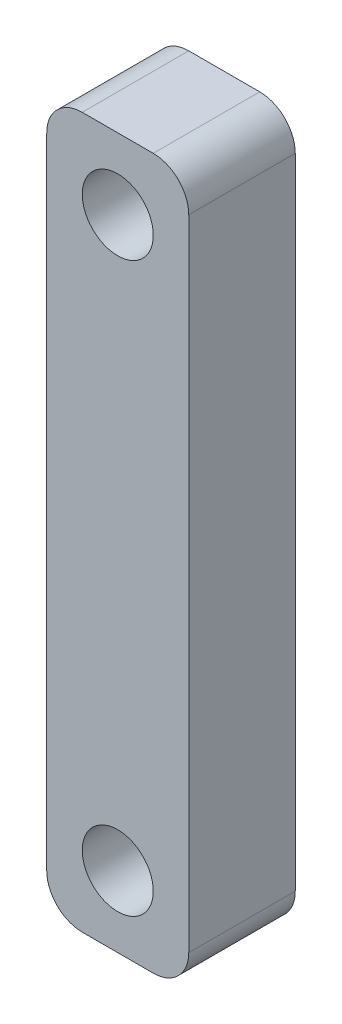
ISO-10303-21;
HEADER;
FILE_DESCRIPTION(('STEP AP214'),'2;1');
FILE_NAME('part.step','',(''),(''),'','','');
FILE_SCHEMA(('AUTOMOTIVE_DESIGN { 1 0 10303 214 1 1 1 1 }'));
ENDSEC;
DATA;
#1=APPLICATION_CONTEXT('core data for automotive mechanical design processes');
#2=APPLICATION_PROTOCOL_DEFINITION('international standard','automotive_design',2000,#1);
#3=PRODUCT_CONTEXT('',#1,'mechanical');
#4=PRODUCT('Part','Part','',(#3));
#5=PRODUCT_RELATED_PRODUCT_CATEGORY('part','',(#4));
#6=PRODUCT_DEFINITION_FORMATION('','',#4);
#7=PRODUCT_DEFINITION_CONTEXT('part definition',#1,'design');
#8=PRODUCT_DEFINITION('design','',#6,#7);
#9=PRODUCT_DEFINITION_SHAPE('','',#8);
#10=(LENGTH_UNIT() NAMED_UNIT(*) SI_UNIT(.MILLI.,.METRE.));
#11=(NAMED_UNIT(*) PLANE_ANGLE_UNIT() SI_UNIT($,.RADIAN.));
#12=(NAMED_UNIT(*) SI_UNIT($,.STERADIAN.) SOLID_ANGLE_UNIT());
#13=UNCERTAINTY_MEASURE_WITH_UNIT(LENGTH_MEASURE(1.E-05),#10,'distance_accuracy_value','');
#14=(GEOMETRIC_REPRESENTATION_CONTEXT(3) GLOBAL_UNCERTAINTY_ASSIGNED_CONTEXT((#13)) GLOBAL_UNIT_ASSIGNED_CONTEXT((#10,
#11,#12)) REPRESENTATION_CONTEXT('',''));
#15=CARTESIAN_POINT('',(0.,0.,0.));
#16=DIRECTION('',(0.,0.,1.));
#17=DIRECTION('',(1.,0.,0.));
#18=AXIS2_PLACEMENT_3D('',#15,#16,#17);
#19=CARTESIAN_POINT('',(0.,0.,3.));
#20=DIRECTION('',(1.,0.,0.));
#21=DIRECTION('',(0.,0.,-1.));
#22=AXIS2_PLACEMENT_3D('',#19,#20,#21);
#23=PLANE('',#22);
#24=DIRECTION('',(0.,-1.,0.));
#25=VECTOR('',#24,1.);
#26=CARTESIAN_POINT('',(0.,0.,3.));
#27=LINE('',#26,#25);
#28=CARTESIAN_POINT('',(0.,19.,3.));
#29=VERTEX_POINT('',#28);
#30=CARTESIAN_POINT('',(0.,1.,3.));
#31=VERTEX_POINT('',#30);
#32=EDGE_CURVE('E117',#29,#31,#27,.T.);
#33=ORIENTED_EDGE('',*,*,#32,.F.);
#34=DIRECTION('',(0.,0.,-1.));
#35=VECTOR('',#34,1.);
#36=CARTESIAN_POINT('',(0.,19.,3.));
#37=LINE('',#36,#35);
#38=CARTESIAN_POINT('',(0.,19.,0.));
#39=VERTEX_POINT('',#38);
#40=EDGE_CURVE('E145',#29,#39,#37,.T.);
#41=ORIENTED_EDGE('',*,*,#40,.T.);
#42=DIRECTION('',(0.,-1.,0.));
#43=VECTOR('',#42,1.);
#44=CARTESIAN_POINT('',(0.,0.,0.));
#45=LINE('',#44,#43);
#46=CARTESIAN_POINT('',(0.,1.,0.));
#47=VERTEX_POINT('',#46);
#48=EDGE_CURVE('E119',#39,#47,#45,.T.);
#49=ORIENTED_EDGE('',*,*,#48,.T.);
#50=DIRECTION('',(0.,0.,-1.));
#51=VECTOR('',#50,1.);
#52=CARTESIAN_POINT('',(0.,1.,3.));
#53=LINE('',#52,#51);
#54=EDGE_CURVE('E140',#47,#31,#53,.F.);
#55=ORIENTED_EDGE('',*,*,#54,.T.);
#56=EDGE_LOOP('',(#33,#41,#49,#55));
#57=FACE_BOUND('',#56,.T.);
#58=ADVANCED_FACE('F33',(#57),#23,.F.);
#59=CARTESIAN_POINT('',(0.,0.,3.));
#60=DIRECTION('',(0.,1.,0.));
#61=DIRECTION('',(0.,0.,1.));
#62=AXIS2_PLACEMENT_3D('',#59,#60,#61);
#63=PLANE('',#62);
#64=DIRECTION('',(1.,0.,0.));
#65=VECTOR('',#64,1.);
#66=CARTESIAN_POINT('',(0.,0.,3.));
#67=LINE('',#66,#65);
#68=CARTESIAN_POINT('',(1.,0.,3.));
#69=VERTEX_POINT('',#68);
#70=CARTESIAN_POINT('',(3.,0.,3.));
#71=VERTEX_POINT('',#70);
#72=EDGE_CURVE('E177',#69,#71,#67,.T.);
#73=ORIENTED_EDGE('',*,*,#72,.F.);
#74=DIRECTION('',(0.,0.,-1.));
#75=VECTOR('',#74,1.);
#76=CARTESIAN_POINT('',(1.,0.,3.));
#77=LINE('',#76,#75);
#78=CARTESIAN_POINT('',(1.,0.,0.));
#79=VERTEX_POINT('',#78);
#80=EDGE_CURVE('E134',#69,#79,#77,.T.);
#81=ORIENTED_EDGE('',*,*,#80,.T.);
#82=DIRECTION('',(1.,0.,0.));
#83=VECTOR('',#82,1.);
#84=CARTESIAN_POINT('',(0.,0.,0.));
#85=LINE('',#84,#83);
#86=CARTESIAN_POINT('',(3.,0.,0.));
#87=VERTEX_POINT('',#86);
#88=EDGE_CURVE('E115',#79,#87,#85,.T.);
#89=ORIENTED_EDGE('',*,*,#88,.T.);
#90=DIRECTION('',(0.,0.,-1.));
#91=VECTOR('',#90,1.);
#92=CARTESIAN_POINT('',(3.,0.,3.));
#93=LINE('',#92,#91);
#94=EDGE_CURVE('E105',#87,#71,#93,.F.);
#95=ORIENTED_EDGE('',*,*,#94,.T.);
#96=EDGE_LOOP('',(#73,#81,#89,#95));
#97=FACE_BOUND('',#96,.T.);
#98=ADVANCED_FACE('F189',(#97),#63,.F.);
#99=CARTESIAN_POINT('',(4.,0.,3.));
#100=DIRECTION('',(-1.,0.,0.));
#101=DIRECTION('',(0.,0.,1.));
#102=AXIS2_PLACEMENT_3D('',#99,#100,#101);
#103=PLANE('',#102);
#104=DIRECTION('',(0.,1.,0.));
#105=VECTOR('',#104,1.);
#106=CARTESIAN_POINT('',(4.,0.,0.));
#107=LINE('',#106,#105);
#108=CARTESIAN_POINT('',(4.,1.,0.));
#109=VERTEX_POINT('',#108);
#110=CARTESIAN_POINT('',(4.,19.,0.));
#111=VERTEX_POINT('',#110);
#112=EDGE_CURVE('E109',#109,#111,#107,.T.);
#113=ORIENTED_EDGE('',*,*,#112,.T.);
#114=DIRECTION('',(0.,0.,-1.));
#115=VECTOR('',#114,1.);
#116=CARTESIAN_POINT('',(4.,19.,3.));
#117=LINE('',#116,#115);
#118=CARTESIAN_POINT('',(4.,19.,3.));
#119=VERTEX_POINT('',#118);
#120=EDGE_CURVE('E41',#111,#119,#117,.F.);
#121=ORIENTED_EDGE('',*,*,#120,.T.);
#122=DIRECTION('',(0.,1.,0.));
#123=VECTOR('',#122,1.);
#124=CARTESIAN_POINT('',(4.,0.,3.));
#125=LINE('',#124,#123);
#126=CARTESIAN_POINT('',(4.,1.,3.));
#127=VERTEX_POINT('',#126);
#128=EDGE_CURVE('E110',#127,#119,#125,.T.);
#129=ORIENTED_EDGE('',*,*,#128,.F.);
#130=DIRECTION('',(0.,0.,-1.));
#131=VECTOR('',#130,1.);
#132=CARTESIAN_POINT('',(4.,1.,3.));
#133=LINE('',#132,#131);
#134=EDGE_CURVE('E103',#127,#109,#133,.T.);
#135=ORIENTED_EDGE('',*,*,#134,.T.);
#136=EDGE_LOOP('',(#113,#121,#129,#135));
#137=FACE_BOUND('',#136,.T.);
#138=ADVANCED_FACE('F108',(#137),#103,.F.);
#139=CARTESIAN_POINT('',(0.,20.,3.));
#140=DIRECTION('',(0.,-1.,0.));
#141=DIRECTION('',(0.,0.,-1.));
#142=AXIS2_PLACEMENT_3D('',#139,#140,#141);
#143=PLANE('',#142);
#144=DIRECTION('',(-1.,0.,0.));
#145=VECTOR('',#144,1.);
#146=CARTESIAN_POINT('',(0.,20.,3.));
#147=LINE('',#146,#145);
#148=CARTESIAN_POINT('',(3.,20.,3.));
#149=VERTEX_POINT('',#148);
#150=CARTESIAN_POINT('',(1.,20.,3.));
#151=VERTEX_POINT('',#150);
#152=EDGE_CURVE('E111',#149,#151,#147,.T.);
#153=ORIENTED_EDGE('',*,*,#152,.F.);
#154=DIRECTION('',(0.,0.,-1.));
#155=VECTOR('',#154,1.);
#156=CARTESIAN_POINT('',(3.,20.,3.));
#157=LINE('',#156,#155);
#158=CARTESIAN_POINT('',(3.,20.,0.));
#159=VERTEX_POINT('',#158);
#160=EDGE_CURVE('E156',#149,#159,#157,.T.);
#161=ORIENTED_EDGE('',*,*,#160,.T.);
#162=DIRECTION('',(-1.,0.,0.));
#163=VECTOR('',#162,1.);
#164=CARTESIAN_POINT('',(0.,20.,0.));
#165=LINE('',#164,#163);
#166=CARTESIAN_POINT('',(1.,20.,0.));
#167=VERTEX_POINT('',#166);
#168=EDGE_CURVE('E114',#159,#167,#165,.T.);
#169=ORIENTED_EDGE('',*,*,#168,.T.);
#170=DIRECTION('',(0.,0.,-1.));
#171=VECTOR('',#170,1.);
#172=CARTESIAN_POINT('',(1.,20.,3.));
#173=LINE('',#172,#171);
#174=EDGE_CURVE('E151',#167,#151,#173,.F.);
#175=ORIENTED_EDGE('',*,*,#174,.T.);
#176=EDGE_LOOP('',(#153,#161,#169,#175));
#177=FACE_BOUND('',#176,.T.);
#178=ADVANCED_FACE('F162',(#177),#143,.F.);
#179=CARTESIAN_POINT('',(0.,0.,3.));
#180=DIRECTION('',(0.,0.,-1.));
#181=DIRECTION('',(-1.,0.,0.));
#182=AXIS2_PLACEMENT_3D('',#179,#180,#181);
#183=PLANE('',#182);
#184=CARTESIAN_POINT('',(2.,18.,3.));
#185=DIRECTION('',(0.,0.,1.));
#186=DIRECTION('',(1.,0.,0.));
#187=AXIS2_PLACEMENT_3D('',#184,#185,#186);
#188=CIRCLE('',#187,1.);
#189=CARTESIAN_POINT('',(3.,18.,3.));
#190=VERTEX_POINT('',#189);
#191=EDGE_CURVE('E129',#190,#190,#188,.T.);
#192=ORIENTED_EDGE('',*,*,#191,.F.);
#193=EDGE_LOOP('',(#192));
#194=FACE_BOUND('',#193,.T.);
#195=CARTESIAN_POINT('',(2.,2.,3.));
#196=DIRECTION('',(0.,0.,1.));
#197=DIRECTION('',(1.,0.,0.));
#198=AXIS2_PLACEMENT_3D('',#195,#196,#197);
#199=CIRCLE('',#198,1.);
#200=CARTESIAN_POINT('',(3.,2.,3.));
#201=VERTEX_POINT('',#200);
#202=EDGE_CURVE('E126',#201,#201,#199,.T.);
#203=ORIENTED_EDGE('',*,*,#202,.F.);
#204=EDGE_LOOP('',(#203));
#205=FACE_BOUND('',#204,.T.);
#206=ORIENTED_EDGE('',*,*,#128,.T.);
#207=CARTESIAN_POINT('',(3.,19.,3.));
#208=DIRECTION('',(0.,0.,-1.));
#209=DIRECTION('',(-1.,0.,0.));
#210=AXIS2_PLACEMENT_3D('',#207,#208,#209);
#211=CIRCLE('',#210,1.);
#212=EDGE_CURVE('E11',#119,#149,#211,.F.);
#213=ORIENTED_EDGE('',*,*,#212,.T.);
#214=ORIENTED_EDGE('',*,*,#152,.T.);
#215=CARTESIAN_POINT('',(1.,19.,3.));
#216=DIRECTION('',(0.,0.,-1.));
#217=DIRECTION('',(-1.,0.,0.));
#218=AXIS2_PLACEMENT_3D('',#215,#216,#217);
#219=CIRCLE('',#218,1.);
#220=EDGE_CURVE('E154',#151,#29,#219,.F.);
#221=ORIENTED_EDGE('',*,*,#220,.T.);
#222=ORIENTED_EDGE('',*,*,#32,.T.);
#223=CARTESIAN_POINT('',(1.,1.,3.));
#224=DIRECTION('',(0.,0.,-1.));
#225=DIRECTION('',(-1.,0.,0.));
#226=AXIS2_PLACEMENT_3D('',#223,#224,#225);
#227=CIRCLE('',#226,1.);
#228=EDGE_CURVE('E143',#31,#69,#227,.F.);
#229=ORIENTED_EDGE('',*,*,#228,.T.);
#230=ORIENTED_EDGE('',*,*,#72,.T.);
#231=CARTESIAN_POINT('',(3.,1.,3.));
#232=DIRECTION('',(0.,0.,-1.));
#233=DIRECTION('',(-1.,0.,0.));
#234=AXIS2_PLACEMENT_3D('',#231,#232,#233);
#235=CIRCLE('',#234,1.);
#236=EDGE_CURVE('E132',#71,#127,#235,.F.);
#237=ORIENTED_EDGE('',*,*,#236,.T.);
#238=EDGE_LOOP('',(#206,#213,#214,#221,#222,#229,#230,#237));
#239=FACE_BOUND('',#238,.T.);
#240=ADVANCED_FACE('F173',(#194,#205,#239),#183,.F.);
#241=CARTESIAN_POINT('',(0.,0.,0.));
#242=DIRECTION('',(0.,0.,-1.));
#243=DIRECTION('',(-1.,0.,0.));
#244=AXIS2_PLACEMENT_3D('',#241,#242,#243);
#245=PLANE('',#244);
#246=CARTESIAN_POINT('',(2.,18.,0.));
#247=DIRECTION('',(0.,0.,-1.));
#248=DIRECTION('',(-1.,0.,0.));
#249=AXIS2_PLACEMENT_3D('',#246,#247,#248);
#250=CIRCLE('',#249,1.);
#251=CARTESIAN_POINT('',(0.999999999999999,18.,0.));
#252=VERTEX_POINT('',#251);
#253=EDGE_CURVE('E127',#252,#252,#250,.T.);
#254=ORIENTED_EDGE('',*,*,#253,.F.);
#255=EDGE_LOOP('',(#254));
#256=FACE_BOUND('',#255,.T.);
#257=CARTESIAN_POINT('',(2.,2.,0.));
#258=DIRECTION('',(0.,0.,-1.));
#259=DIRECTION('',(-1.,0.,0.));
#260=AXIS2_PLACEMENT_3D('',#257,#258,#259);
#261=CIRCLE('',#260,1.);
#262=CARTESIAN_POINT('',(1.,2.,0.));
#263=VERTEX_POINT('',#262);
#264=EDGE_CURVE('E123',#263,#263,#261,.T.);
#265=ORIENTED_EDGE('',*,*,#264,.F.);
#266=EDGE_LOOP('',(#265));
#267=FACE_BOUND('',#266,.T.);
#268=ORIENTED_EDGE('',*,*,#168,.F.);
#269=CARTESIAN_POINT('',(3.,19.,0.));
#270=DIRECTION('',(0.,0.,-1.));
#271=DIRECTION('',(-1.,0.,0.));
#272=AXIS2_PLACEMENT_3D('',#269,#270,#271);
#273=CIRCLE('',#272,1.);
#274=EDGE_CURVE('E55',#159,#111,#273,.T.);
#275=ORIENTED_EDGE('',*,*,#274,.T.);
#276=ORIENTED_EDGE('',*,*,#112,.F.);
#277=CARTESIAN_POINT('',(3.,1.,0.));
#278=DIRECTION('',(0.,0.,-1.));
#279=DIRECTION('',(-1.,0.,0.));
#280=AXIS2_PLACEMENT_3D('',#277,#278,#279);
#281=CIRCLE('',#280,1.);
#282=EDGE_CURVE('E99',#109,#87,#281,.T.);
#283=ORIENTED_EDGE('',*,*,#282,.T.);
#284=ORIENTED_EDGE('',*,*,#88,.F.);
#285=CARTESIAN_POINT('',(1.,1.,0.));
#286=DIRECTION('',(0.,0.,-1.));
#287=DIRECTION('',(-1.,0.,0.));
#288=AXIS2_PLACEMENT_3D('',#285,#286,#287);
#289=CIRCLE('',#288,1.);
#290=EDGE_CURVE('E137',#79,#47,#289,.T.);
#291=ORIENTED_EDGE('',*,*,#290,.T.);
#292=ORIENTED_EDGE('',*,*,#48,.F.);
#293=CARTESIAN_POINT('',(1.,19.,0.));
#294=DIRECTION('',(0.,0.,-1.));
#295=DIRECTION('',(-1.,0.,0.));
#296=AXIS2_PLACEMENT_3D('',#293,#294,#295);
#297=CIRCLE('',#296,1.);
#298=EDGE_CURVE('E148',#39,#167,#297,.T.);
#299=ORIENTED_EDGE('',*,*,#298,.T.);
#300=EDGE_LOOP('',(#268,#275,#276,#283,#284,#291,#292,#299));
#301=FACE_BOUND('',#300,.T.);
#302=ADVANCED_FACE('F113',(#256,#267,#301),#245,.T.);
#303=CARTESIAN_POINT('',(2.,2.,-3.));
#304=DIRECTION('',(0.,0.,1.));
#305=DIRECTION('',(1.,0.,0.));
#306=AXIS2_PLACEMENT_3D('',#303,#304,#305);
#307=CYLINDRICAL_SURFACE('',#306,1.);
#308=ORIENTED_EDGE('',*,*,#264,.T.);
#309=EDGE_LOOP('',(#308));
#310=FACE_BOUND('',#309,.T.);
#311=ORIENTED_EDGE('',*,*,#202,.T.);
#312=EDGE_LOOP('',(#311));
#313=FACE_BOUND('',#312,.T.);
#314=ADVANCED_FACE('F252',(#310,#313),#307,.F.);
#315=CARTESIAN_POINT('',(2.,18.,-3.));
#316=DIRECTION('',(0.,0.,1.));
#317=DIRECTION('',(1.,0.,0.));
#318=AXIS2_PLACEMENT_3D('',#315,#316,#317);
#319=CYLINDRICAL_SURFACE('',#318,1.);
#320=ORIENTED_EDGE('',*,*,#253,.T.);
#321=EDGE_LOOP('',(#320));
#322=FACE_BOUND('',#321,.T.);
#323=ORIENTED_EDGE('',*,*,#191,.T.);
#324=EDGE_LOOP('',(#323));
#325=FACE_BOUND('',#324,.T.);
#326=ADVANCED_FACE('F204',(#322,#325),#319,.F.);
#327=CARTESIAN_POINT('',(3.,1.,3.));
#328=DIRECTION('',(0.,0.,-1.));
#329=DIRECTION('',(-1.,0.,0.));
#330=AXIS2_PLACEMENT_3D('',#327,#328,#329);
#331=CYLINDRICAL_SURFACE('',#330,1.);
#332=ORIENTED_EDGE('',*,*,#236,.F.);
#333=ORIENTED_EDGE('',*,*,#94,.F.);
#334=ORIENTED_EDGE('',*,*,#282,.F.);
#335=ORIENTED_EDGE('',*,*,#134,.F.);
#336=EDGE_LOOP('',(#332,#333,#334,#335));
#337=FACE_BOUND('',#336,.T.);
#338=ADVANCED_FACE('F102',(#337),#331,.T.);
#339=CARTESIAN_POINT('',(1.,1.,3.));
#340=DIRECTION('',(0.,0.,-1.));
#341=DIRECTION('',(-1.,0.,0.));
#342=AXIS2_PLACEMENT_3D('',#339,#340,#341);
#343=CYLINDRICAL_SURFACE('',#342,1.);
#344=ORIENTED_EDGE('',*,*,#228,.F.);
#345=ORIENTED_EDGE('',*,*,#54,.F.);
#346=ORIENTED_EDGE('',*,*,#290,.F.);
#347=ORIENTED_EDGE('',*,*,#80,.F.);
#348=EDGE_LOOP('',(#344,#345,#346,#347));
#349=FACE_BOUND('',#348,.T.);
#350=ADVANCED_FACE('F186',(#349),#343,.T.);
#351=CARTESIAN_POINT('',(1.,19.,3.));
#352=DIRECTION('',(0.,0.,-1.));
#353=DIRECTION('',(-1.,0.,0.));
#354=AXIS2_PLACEMENT_3D('',#351,#352,#353);
#355=CYLINDRICAL_SURFACE('',#354,1.);
#356=ORIENTED_EDGE('',*,*,#220,.F.);
#357=ORIENTED_EDGE('',*,*,#174,.F.);
#358=ORIENTED_EDGE('',*,*,#298,.F.);
#359=ORIENTED_EDGE('',*,*,#40,.F.);
#360=EDGE_LOOP('',(#356,#357,#358,#359));
#361=FACE_BOUND('',#360,.T.);
#362=ADVANCED_FACE('F170',(#361),#355,.T.);
#363=CARTESIAN_POINT('',(3.,19.,3.));
#364=DIRECTION('',(0.,0.,-1.));
#365=DIRECTION('',(-1.,0.,0.));
#366=AXIS2_PLACEMENT_3D('',#363,#364,#365);
#367=CYLINDRICAL_SURFACE('',#366,1.);
#368=ORIENTED_EDGE('',*,*,#212,.F.);
#369=ORIENTED_EDGE('',*,*,#120,.F.);
#370=ORIENTED_EDGE('',*,*,#274,.F.);
#371=ORIENTED_EDGE('',*,*,#160,.F.);
#372=EDGE_LOOP('',(#368,#369,#370,#371));
#373=FACE_BOUND('',#372,.T.);
#374=ADVANCED_FACE('F35',(#373),#367,.T.);
#375=CLOSED_SHELL('',(#58,#98,#138,#178,#240,#302,#314,#326,#338,#350,#362,#374));
#376=MANIFOLD_SOLID_BREP('B2',#375);
#377=ADVANCED_BREP_SHAPE_REPRESENTATION('',(#18,#376),#14);
#378=SHAPE_DEFINITION_REPRESENTATION(#9,#377);
ENDSEC;
END-ISO-10303-21;
